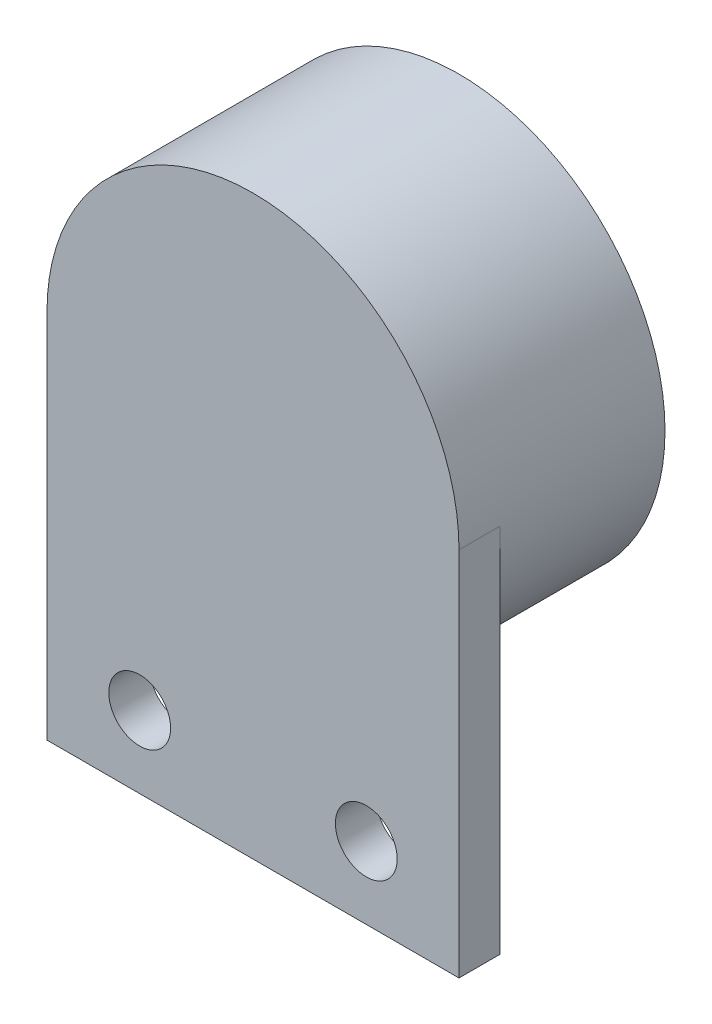
ISO-10303-21;
HEADER;
FILE_DESCRIPTION(('STEP AP214'),'2;1');
FILE_NAME('part.step','',(''),(''),'','','');
FILE_SCHEMA(('AUTOMOTIVE_DESIGN { 1 0 10303 214 1 1 1 1 }'));
ENDSEC;
DATA;
#1=APPLICATION_CONTEXT('core data for automotive mechanical design processes');
#2=APPLICATION_PROTOCOL_DEFINITION('international standard','automotive_design',2000,#1);
#3=PRODUCT_CONTEXT('',#1,'mechanical');
#4=PRODUCT('Part','Part','',(#3));
#5=PRODUCT_RELATED_PRODUCT_CATEGORY('part','',(#4));
#6=PRODUCT_DEFINITION_FORMATION('','',#4);
#7=PRODUCT_DEFINITION_CONTEXT('part definition',#1,'design');
#8=PRODUCT_DEFINITION('design','',#6,#7);
#9=PRODUCT_DEFINITION_SHAPE('','',#8);
#10=(LENGTH_UNIT() NAMED_UNIT(*) SI_UNIT(.MILLI.,.METRE.));
#11=(NAMED_UNIT(*) PLANE_ANGLE_UNIT() SI_UNIT($,.RADIAN.));
#12=(NAMED_UNIT(*) SI_UNIT($,.STERADIAN.) SOLID_ANGLE_UNIT());
#13=UNCERTAINTY_MEASURE_WITH_UNIT(LENGTH_MEASURE(1.E-05),#10,'distance_accuracy_value','');
#14=(GEOMETRIC_REPRESENTATION_CONTEXT(3) GLOBAL_UNCERTAINTY_ASSIGNED_CONTEXT((#13)) GLOBAL_UNIT_ASSIGNED_CONTEXT((#10,
#11,#12)) REPRESENTATION_CONTEXT('',''));
#15=CARTESIAN_POINT('',(0.,0.,0.));
#16=DIRECTION('',(0.,0.,1.));
#17=DIRECTION('',(1.,0.,0.));
#18=AXIS2_PLACEMENT_3D('',#15,#16,#17);
#19=CARTESIAN_POINT('',(0.,0.,10.));
#20=DIRECTION('',(0.,0.,-1.));
#21=DIRECTION('',(-1.,0.,0.));
#22=AXIS2_PLACEMENT_3D('',#19,#20,#21);
#23=CYLINDRICAL_SURFACE('',#22,10.);
#24=CARTESIAN_POINT('',(0.,0.,8.));
#25=DIRECTION('',(0.,0.,1.));
#26=DIRECTION('',(1.,0.,0.));
#27=AXIS2_PLACEMENT_3D('',#24,#25,#26);
#28=CIRCLE('',#27,10.);
#29=CARTESIAN_POINT('',(-10.,0.,8.));
#30=VERTEX_POINT('',#29);
#31=CARTESIAN_POINT('',(10.,0.,8.));
#32=VERTEX_POINT('',#31);
#33=EDGE_CURVE('E50',#30,#32,#28,.T.);
#34=ORIENTED_EDGE('',*,*,#33,.F.);
#35=DIRECTION('',(0.,0.,1.));
#36=VECTOR('',#35,1.);
#37=CARTESIAN_POINT('',(-10.,0.,8.));
#38=LINE('',#37,#36);
#39=CARTESIAN_POINT('',(-10.,0.,10.));
#40=VERTEX_POINT('',#39);
#41=EDGE_CURVE('E66',#30,#40,#38,.T.);
#42=ORIENTED_EDGE('',*,*,#41,.T.);
#43=CARTESIAN_POINT('',(0.,0.,10.));
#44=DIRECTION('',(0.,0.,1.));
#45=DIRECTION('',(1.,0.,0.));
#46=AXIS2_PLACEMENT_3D('',#43,#44,#45);
#47=CIRCLE('',#46,10.);
#48=CARTESIAN_POINT('',(10.,0.,10.));
#49=VERTEX_POINT('',#48);
#50=EDGE_CURVE('E129',#49,#40,#47,.T.);
#51=ORIENTED_EDGE('',*,*,#50,.F.);
#52=DIRECTION('',(0.,0.,1.));
#53=VECTOR('',#52,1.);
#54=CARTESIAN_POINT('',(10.,0.,8.));
#55=LINE('',#54,#53);
#56=EDGE_CURVE('E98',#32,#49,#55,.T.);
#57=ORIENTED_EDGE('',*,*,#56,.F.);
#58=EDGE_LOOP('',(#34,#42,#51,#57));
#59=FACE_BOUND('',#58,.T.);
#60=CARTESIAN_POINT('',(0.,0.,0.));
#61=DIRECTION('',(0.,0.,1.));
#62=DIRECTION('',(1.,0.,0.));
#63=AXIS2_PLACEMENT_3D('',#60,#61,#62);
#64=CIRCLE('',#63,10.);
#65=CARTESIAN_POINT('',(10.,0.,0.));
#66=VERTEX_POINT('',#65);
#67=EDGE_CURVE('E124',#66,#66,#64,.T.);
#68=ORIENTED_EDGE('',*,*,#67,.T.);
#69=EDGE_LOOP('',(#68));
#70=FACE_BOUND('',#69,.T.);
#71=ADVANCED_FACE('F42',(#59,#70),#23,.T.);
#72=CARTESIAN_POINT('',(0.,0.,10.));
#73=DIRECTION('',(0.,0.,1.));
#74=DIRECTION('',(1.,0.,0.));
#75=AXIS2_PLACEMENT_3D('',#72,#73,#74);
#76=PLANE('',#75);
#77=CARTESIAN_POINT('',(5.5,-14.5,10.));
#78=DIRECTION('',(0.,0.,-1.));
#79=DIRECTION('',(-1.,0.,0.));
#80=AXIS2_PLACEMENT_3D('',#77,#78,#79);
#81=CIRCLE('',#80,1.5);
#82=CARTESIAN_POINT('',(4.,-14.5,10.));
#83=VERTEX_POINT('',#82);
#84=EDGE_CURVE('E270',#83,#83,#81,.T.);
#85=ORIENTED_EDGE('',*,*,#84,.T.);
#86=EDGE_LOOP('',(#85));
#87=FACE_BOUND('',#86,.T.);
#88=CARTESIAN_POINT('',(-5.5,-14.5,10.));
#89=DIRECTION('',(0.,0.,-1.));
#90=DIRECTION('',(-1.,0.,0.));
#91=AXIS2_PLACEMENT_3D('',#88,#89,#90);
#92=CIRCLE('',#91,1.5);
#93=CARTESIAN_POINT('',(-7.,-14.5,10.));
#94=VERTEX_POINT('',#93);
#95=EDGE_CURVE('E276',#94,#94,#92,.T.);
#96=ORIENTED_EDGE('',*,*,#95,.T.);
#97=EDGE_LOOP('',(#96));
#98=FACE_BOUND('',#97,.T.);
#99=ORIENTED_EDGE('',*,*,#50,.T.);
#100=DIRECTION('',(0.,-1.,0.));
#101=VECTOR('',#100,1.);
#102=CARTESIAN_POINT('',(-10.,0.,10.));
#103=LINE('',#102,#101);
#104=CARTESIAN_POINT('',(-10.,-18.,10.));
#105=VERTEX_POINT('',#104);
#106=EDGE_CURVE('E81',#40,#105,#103,.T.);
#107=ORIENTED_EDGE('',*,*,#106,.T.);
#108=DIRECTION('',(1.,0.,0.));
#109=VECTOR('',#108,1.);
#110=CARTESIAN_POINT('',(-10.,-18.,10.));
#111=LINE('',#110,#109);
#112=CARTESIAN_POINT('',(10.,-18.,10.));
#113=VERTEX_POINT('',#112);
#114=EDGE_CURVE('E116',#105,#113,#111,.T.);
#115=ORIENTED_EDGE('',*,*,#114,.T.);
#116=DIRECTION('',(0.,1.,0.));
#117=VECTOR('',#116,1.);
#118=CARTESIAN_POINT('',(10.,0.,10.));
#119=LINE('',#118,#117);
#120=EDGE_CURVE('E57',#113,#49,#119,.T.);
#121=ORIENTED_EDGE('',*,*,#120,.T.);
#122=EDGE_LOOP('',(#99,#107,#115,#121));
#123=FACE_BOUND('',#122,.T.);
#124=ADVANCED_FACE('F141',(#87,#98,#123),#76,.T.);
#125=CARTESIAN_POINT('',(0.,0.,0.));
#126=DIRECTION('',(0.,0.,1.));
#127=DIRECTION('',(1.,0.,0.));
#128=AXIS2_PLACEMENT_3D('',#125,#126,#127);
#129=PLANE('',#128);
#130=CARTESIAN_POINT('',(0.,0.,0.));
#131=DIRECTION('',(0.,0.,1.));
#132=DIRECTION('',(1.,0.,0.));
#133=AXIS2_PLACEMENT_3D('',#130,#131,#132);
#134=CIRCLE('',#133,1.);
#135=CARTESIAN_POINT('',(1.,0.,0.));
#136=VERTEX_POINT('',#135);
#137=EDGE_CURVE('E11',#136,#136,#134,.F.);
#138=ORIENTED_EDGE('',*,*,#137,.F.);
#139=EDGE_LOOP('',(#138));
#140=FACE_BOUND('',#139,.T.);
#141=ORIENTED_EDGE('',*,*,#67,.F.);
#142=EDGE_LOOP('',(#141));
#143=FACE_BOUND('',#142,.T.);
#144=ADVANCED_FACE('F138',(#140,#143),#129,.F.);
#145=CARTESIAN_POINT('',(-10.,0.,8.));
#146=DIRECTION('',(-1.,0.,0.));
#147=DIRECTION('',(0.,-1.,0.));
#148=AXIS2_PLACEMENT_3D('',#145,#146,#147);
#149=PLANE('',#148);
#150=ORIENTED_EDGE('',*,*,#106,.F.);
#151=ORIENTED_EDGE('',*,*,#41,.F.);
#152=DIRECTION('',(0.,-1.,0.));
#153=VECTOR('',#152,1.);
#154=CARTESIAN_POINT('',(-10.,0.,8.));
#155=LINE('',#154,#153);
#156=CARTESIAN_POINT('',(-10.,-18.,8.));
#157=VERTEX_POINT('',#156);
#158=EDGE_CURVE('E108',#30,#157,#155,.T.);
#159=ORIENTED_EDGE('',*,*,#158,.T.);
#160=DIRECTION('',(0.,0.,1.));
#161=VECTOR('',#160,1.);
#162=CARTESIAN_POINT('',(-10.,-18.,8.));
#163=LINE('',#162,#161);
#164=EDGE_CURVE('E87',#157,#105,#163,.T.);
#165=ORIENTED_EDGE('',*,*,#164,.T.);
#166=EDGE_LOOP('',(#150,#151,#159,#165));
#167=FACE_BOUND('',#166,.T.);
#168=ADVANCED_FACE('F140',(#167),#149,.T.);
#169=CARTESIAN_POINT('',(10.,0.,8.));
#170=DIRECTION('',(1.,0.,0.));
#171=DIRECTION('',(0.,1.,0.));
#172=AXIS2_PLACEMENT_3D('',#169,#170,#171);
#173=PLANE('',#172);
#174=ORIENTED_EDGE('',*,*,#120,.F.);
#175=DIRECTION('',(0.,0.,1.));
#176=VECTOR('',#175,1.);
#177=CARTESIAN_POINT('',(10.,-18.,8.));
#178=LINE('',#177,#176);
#179=CARTESIAN_POINT('',(10.,-18.,8.));
#180=VERTEX_POINT('',#179);
#181=EDGE_CURVE('E92',#180,#113,#178,.T.);
#182=ORIENTED_EDGE('',*,*,#181,.F.);
#183=DIRECTION('',(0.,1.,0.));
#184=VECTOR('',#183,1.);
#185=CARTESIAN_POINT('',(10.,0.,8.));
#186=LINE('',#185,#184);
#187=EDGE_CURVE('E95',#180,#32,#186,.T.);
#188=ORIENTED_EDGE('',*,*,#187,.T.);
#189=ORIENTED_EDGE('',*,*,#56,.T.);
#190=EDGE_LOOP('',(#174,#182,#188,#189));
#191=FACE_BOUND('',#190,.T.);
#192=ADVANCED_FACE('F94',(#191),#173,.T.);
#193=CARTESIAN_POINT('',(-10.,-18.,8.));
#194=DIRECTION('',(0.,-1.,0.));
#195=DIRECTION('',(0.,0.,-1.));
#196=AXIS2_PLACEMENT_3D('',#193,#194,#195);
#197=PLANE('',#196);
#198=ORIENTED_EDGE('',*,*,#114,.F.);
#199=ORIENTED_EDGE('',*,*,#164,.F.);
#200=DIRECTION('',(1.,0.,0.));
#201=VECTOR('',#200,1.);
#202=CARTESIAN_POINT('',(-10.,-18.,8.));
#203=LINE('',#202,#201);
#204=EDGE_CURVE('E102',#157,#180,#203,.T.);
#205=ORIENTED_EDGE('',*,*,#204,.T.);
#206=ORIENTED_EDGE('',*,*,#181,.T.);
#207=EDGE_LOOP('',(#198,#199,#205,#206));
#208=FACE_BOUND('',#207,.T.);
#209=ADVANCED_FACE('F106',(#208),#197,.T.);
#210=CARTESIAN_POINT('',(0.,0.,8.));
#211=DIRECTION('',(0.,0.,1.));
#212=DIRECTION('',(1.,0.,0.));
#213=AXIS2_PLACEMENT_3D('',#210,#211,#212);
#214=PLANE('',#213);
#215=CARTESIAN_POINT('',(5.5,-14.5,8.));
#216=DIRECTION('',(0.,0.,-1.));
#217=DIRECTION('',(-1.,0.,0.));
#218=AXIS2_PLACEMENT_3D('',#215,#216,#217);
#219=CIRCLE('',#218,1.5);
#220=CARTESIAN_POINT('',(4.,-14.5,8.));
#221=VERTEX_POINT('',#220);
#222=EDGE_CURVE('E273',#221,#221,#219,.T.);
#223=ORIENTED_EDGE('',*,*,#222,.F.);
#224=EDGE_LOOP('',(#223));
#225=FACE_BOUND('',#224,.T.);
#226=CARTESIAN_POINT('',(-5.5,-14.5,8.));
#227=DIRECTION('',(0.,0.,-1.));
#228=DIRECTION('',(-1.,0.,0.));
#229=AXIS2_PLACEMENT_3D('',#226,#227,#228);
#230=CIRCLE('',#229,1.5);
#231=CARTESIAN_POINT('',(-7.,-14.5,8.));
#232=VERTEX_POINT('',#231);
#233=EDGE_CURVE('E280',#232,#232,#230,.T.);
#234=ORIENTED_EDGE('',*,*,#233,.F.);
#235=EDGE_LOOP('',(#234));
#236=FACE_BOUND('',#235,.T.);
#237=ORIENTED_EDGE('',*,*,#158,.F.);
#238=ORIENTED_EDGE('',*,*,#33,.T.);
#239=ORIENTED_EDGE('',*,*,#187,.F.);
#240=ORIENTED_EDGE('',*,*,#204,.F.);
#241=EDGE_LOOP('',(#237,#238,#239,#240));
#242=FACE_BOUND('',#241,.T.);
#243=ADVANCED_FACE('F101',(#225,#236,#242),#214,.F.);
#244=CARTESIAN_POINT('',(0.,0.,-2.));
#245=DIRECTION('',(0.,0.,1.));
#246=DIRECTION('',(1.,0.,0.));
#247=AXIS2_PLACEMENT_3D('',#244,#245,#246);
#248=CYLINDRICAL_SURFACE('',#247,1.);
#249=CARTESIAN_POINT('',(0.,0.,-2.));
#250=DIRECTION('',(0.,0.,-1.));
#251=DIRECTION('',(-1.,0.,0.));
#252=AXIS2_PLACEMENT_3D('',#249,#250,#251);
#253=CIRCLE('',#252,1.);
#254=CARTESIAN_POINT('',(-1.,0.,-2.));
#255=VERTEX_POINT('',#254);
#256=EDGE_CURVE('E117',#255,#255,#253,.T.);
#257=ORIENTED_EDGE('',*,*,#256,.F.);
#258=EDGE_LOOP('',(#257));
#259=FACE_BOUND('',#258,.T.);
#260=ORIENTED_EDGE('',*,*,#137,.T.);
#261=EDGE_LOOP('',(#260));
#262=FACE_BOUND('',#261,.T.);
#263=ADVANCED_FACE('F178',(#259,#262),#248,.T.);
#264=CARTESIAN_POINT('',(0.,0.,-2.));
#265=DIRECTION('',(0.,0.,-1.));
#266=DIRECTION('',(-1.,0.,0.));
#267=AXIS2_PLACEMENT_3D('',#264,#265,#266);
#268=PLANE('',#267);
#269=ORIENTED_EDGE('',*,*,#256,.T.);
#270=EDGE_LOOP('',(#269));
#271=FACE_BOUND('',#270,.T.);
#272=ADVANCED_FACE('F170',(#271),#268,.T.);
#273=CARTESIAN_POINT('',(-5.5,-14.5,10.));
#274=DIRECTION('',(0.,0.,-1.));
#275=DIRECTION('',(-1.,0.,0.));
#276=AXIS2_PLACEMENT_3D('',#273,#274,#275);
#277=CYLINDRICAL_SURFACE('',#276,1.5);
#278=ORIENTED_EDGE('',*,*,#95,.F.);
#279=EDGE_LOOP('',(#278));
#280=FACE_BOUND('',#279,.T.);
#281=ORIENTED_EDGE('',*,*,#233,.T.);
#282=EDGE_LOOP('',(#281));
#283=FACE_BOUND('',#282,.T.);
#284=ADVANCED_FACE('F185',(#280,#283),#277,.F.);
#285=CARTESIAN_POINT('',(5.5,-14.5,10.));
#286=DIRECTION('',(0.,0.,-1.));
#287=DIRECTION('',(-1.,0.,0.));
#288=AXIS2_PLACEMENT_3D('',#285,#286,#287);
#289=CYLINDRICAL_SURFACE('',#288,1.5);
#290=ORIENTED_EDGE('',*,*,#84,.F.);
#291=EDGE_LOOP('',(#290));
#292=FACE_BOUND('',#291,.T.);
#293=ORIENTED_EDGE('',*,*,#222,.T.);
#294=EDGE_LOOP('',(#293));
#295=FACE_BOUND('',#294,.T.);
#296=ADVANCED_FACE('F190',(#292,#295),#289,.F.);
#297=CLOSED_SHELL('',(#71,#124,#144,#168,#192,#209,#243,#263,#272,#284,#296));
#298=MANIFOLD_SOLID_BREP('B2',#297);
#299=ADVANCED_BREP_SHAPE_REPRESENTATION('',(#18,#298),#14);
#300=SHAPE_DEFINITION_REPRESENTATION(#9,#299);
ENDSEC;
END-ISO-10303-21;
